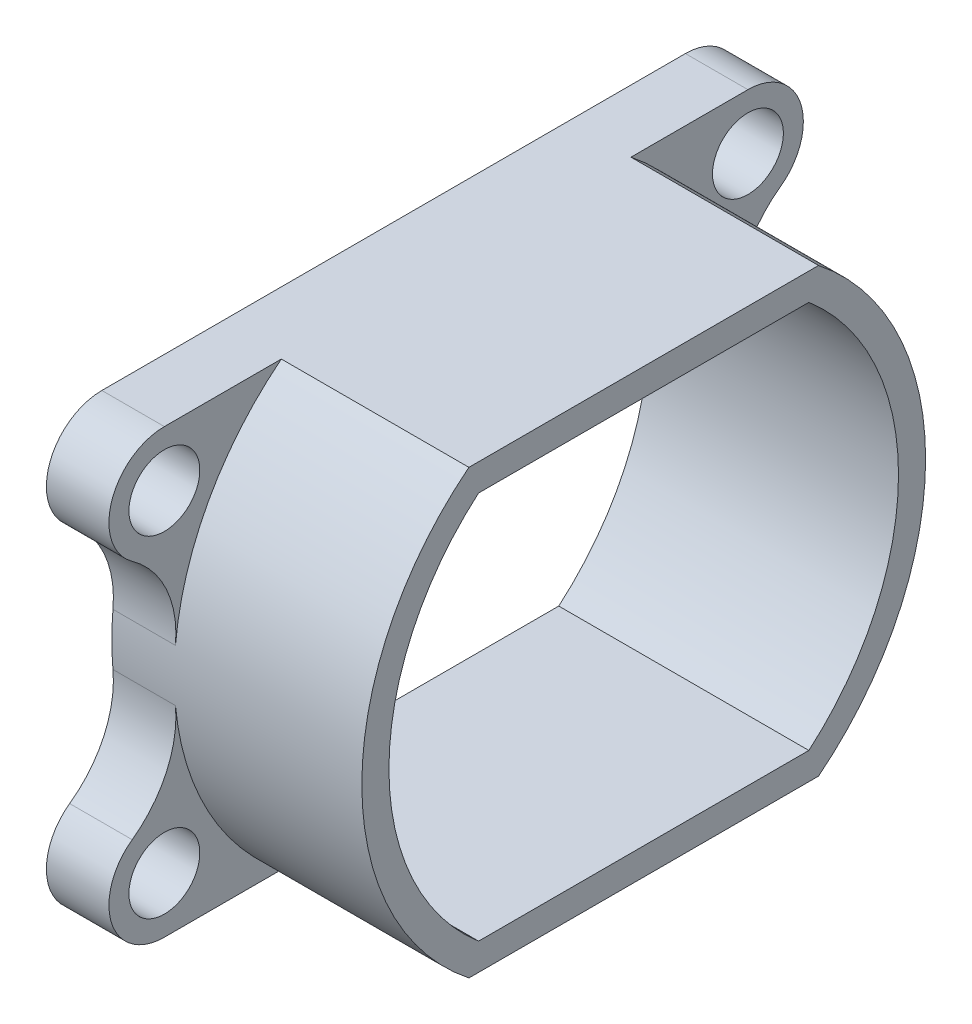
ISO-10303-21;
HEADER;
FILE_DESCRIPTION(('STEP AP214'),'2;1');
FILE_NAME('part.step','',(''),(''),'','','');
FILE_SCHEMA(('AUTOMOTIVE_DESIGN { 1 0 10303 214 1 1 1 1 }'));
ENDSEC;
DATA;
#1=APPLICATION_CONTEXT('core data for automotive mechanical design processes');
#2=APPLICATION_PROTOCOL_DEFINITION('international standard','automotive_design',2000,#1);
#3=PRODUCT_CONTEXT('',#1,'mechanical');
#4=PRODUCT('Part','Part','',(#3));
#5=PRODUCT_RELATED_PRODUCT_CATEGORY('part','',(#4));
#6=PRODUCT_DEFINITION_FORMATION('','',#4);
#7=PRODUCT_DEFINITION_CONTEXT('part definition',#1,'design');
#8=PRODUCT_DEFINITION('design','',#6,#7);
#9=PRODUCT_DEFINITION_SHAPE('','',#8);
#10=(LENGTH_UNIT() NAMED_UNIT(*) SI_UNIT(.MILLI.,.METRE.));
#11=(NAMED_UNIT(*) PLANE_ANGLE_UNIT() SI_UNIT($,.RADIAN.));
#12=(NAMED_UNIT(*) SI_UNIT($,.STERADIAN.) SOLID_ANGLE_UNIT());
#13=UNCERTAINTY_MEASURE_WITH_UNIT(LENGTH_MEASURE(1.E-05),#10,'distance_accuracy_value','');
#14=(GEOMETRIC_REPRESENTATION_CONTEXT(3) GLOBAL_UNCERTAINTY_ASSIGNED_CONTEXT((#13)) GLOBAL_UNIT_ASSIGNED_CONTEXT((#10,
#11,#12)) REPRESENTATION_CONTEXT('',''));
#15=CARTESIAN_POINT('',(0.,0.,0.));
#16=DIRECTION('',(0.,0.,1.));
#17=DIRECTION('',(1.,0.,0.));
#18=AXIS2_PLACEMENT_3D('',#15,#16,#17);
#19=CARTESIAN_POINT('',(12.,0.,0.));
#20=DIRECTION('',(-1.,0.,0.));
#21=DIRECTION('',(0.,0.,1.));
#22=AXIS2_PLACEMENT_3D('',#19,#20,#21);
#23=CYLINDRICAL_SURFACE('',#22,13.525);
#24=CARTESIAN_POINT('',(0.,0.,0.));
#25=DIRECTION('',(1.,0.,0.));
#26=DIRECTION('',(0.,0.,-1.));
#27=AXIS2_PLACEMENT_3D('',#24,#25,#26);
#28=CIRCLE('',#27,13.525);
#29=CARTESIAN_POINT('',(0.,1.25000368509018,13.4671123774646));
#30=VERTEX_POINT('',#29);
#31=CARTESIAN_POINT('',(0.,-1.25000368509018,13.4671123774646));
#32=VERTEX_POINT('',#31);
#33=EDGE_CURVE('E299',#30,#32,#28,.T.);
#34=ORIENTED_EDGE('',*,*,#33,.T.);
#35=DIRECTION('',(-1.,0.,0.));
#36=VECTOR('',#35,1.);
#37=CARTESIAN_POINT('',(12.,-1.25000368509018,13.4671123774646));
#38=LINE('',#37,#36);
#39=CARTESIAN_POINT('',(3.,-1.25000368509018,13.4671123774646));
#40=VERTEX_POINT('',#39);
#41=EDGE_CURVE('E344',#32,#40,#38,.F.);
#42=ORIENTED_EDGE('',*,*,#41,.T.);
#43=CARTESIAN_POINT('',(3.,0.,0.));
#44=DIRECTION('',(-1.,0.,0.));
#45=DIRECTION('',(0.,0.,1.));
#46=AXIS2_PLACEMENT_3D('',#43,#44,#45);
#47=CIRCLE('',#46,13.525);
#48=CARTESIAN_POINT('',(3.,-10.61,8.38770081726812));
#49=VERTEX_POINT('',#48);
#50=EDGE_CURVE('E220',#49,#40,#47,.T.);
#51=ORIENTED_EDGE('',*,*,#50,.F.);
#52=DIRECTION('',(-1.,0.,0.));
#53=VECTOR('',#52,1.);
#54=CARTESIAN_POINT('',(12.,-10.61,8.38770081726812));
#55=LINE('',#54,#53);
#56=CARTESIAN_POINT('',(12.,-10.61,8.38770081726812));
#57=VERTEX_POINT('',#56);
#58=EDGE_CURVE('E324',#57,#49,#55,.T.);
#59=ORIENTED_EDGE('',*,*,#58,.F.);
#60=CARTESIAN_POINT('',(12.,0.,0.));
#61=DIRECTION('',(1.,0.,0.));
#62=DIRECTION('',(0.,0.,-1.));
#63=AXIS2_PLACEMENT_3D('',#60,#61,#62);
#64=CIRCLE('',#63,13.525);
#65=CARTESIAN_POINT('',(12.,10.61,8.38770081726812));
#66=VERTEX_POINT('',#65);
#67=EDGE_CURVE('E300',#66,#57,#64,.T.);
#68=ORIENTED_EDGE('',*,*,#67,.F.);
#69=DIRECTION('',(-1.,0.,0.));
#70=VECTOR('',#69,1.);
#71=CARTESIAN_POINT('',(12.,10.61,8.38770081726812));
#72=LINE('',#71,#70);
#73=CARTESIAN_POINT('',(3.,10.61,8.38770081726812));
#74=VERTEX_POINT('',#73);
#75=EDGE_CURVE('E309',#66,#74,#72,.T.);
#76=ORIENTED_EDGE('',*,*,#75,.T.);
#77=CARTESIAN_POINT('',(3.,0.,0.));
#78=DIRECTION('',(-1.,0.,0.));
#79=DIRECTION('',(0.,0.,1.));
#80=AXIS2_PLACEMENT_3D('',#77,#78,#79);
#81=CIRCLE('',#80,13.525);
#82=CARTESIAN_POINT('',(3.,1.25000368509018,13.4671123774646));
#83=VERTEX_POINT('',#82);
#84=EDGE_CURVE('E187',#83,#74,#81,.T.);
#85=ORIENTED_EDGE('',*,*,#84,.F.);
#86=DIRECTION('',(-1.,0.,0.));
#87=VECTOR('',#86,1.);
#88=CARTESIAN_POINT('',(12.,1.25000368509018,13.4671123774646));
#89=LINE('',#88,#87);
#90=EDGE_CURVE('E341',#83,#30,#89,.T.);
#91=ORIENTED_EDGE('',*,*,#90,.T.);
#92=EDGE_LOOP('',(#34,#42,#51,#59,#68,#76,#85,#91));
#93=FACE_BOUND('',#92,.T.);
#94=ADVANCED_FACE('F43',(#93),#23,.T.);
#95=CARTESIAN_POINT('',(12.,0.,0.));
#96=DIRECTION('',(-1.,0.,0.));
#97=DIRECTION('',(0.,0.,1.));
#98=AXIS2_PLACEMENT_3D('',#95,#96,#97);
#99=CYLINDRICAL_SURFACE('',#98,13.525);
#100=CARTESIAN_POINT('',(3.,0.,0.));
#101=DIRECTION('',(-1.,0.,0.));
#102=DIRECTION('',(0.,0.,1.));
#103=AXIS2_PLACEMENT_3D('',#100,#101,#102);
#104=CIRCLE('',#103,13.525);
#105=CARTESIAN_POINT('',(3.,-1.25000368509018,-13.4671123774646));
#106=VERTEX_POINT('',#105);
#107=CARTESIAN_POINT('',(3.,-10.61,-8.38770081726812));
#108=VERTEX_POINT('',#107);
#109=EDGE_CURVE('E236',#106,#108,#104,.T.);
#110=ORIENTED_EDGE('',*,*,#109,.F.);
#111=DIRECTION('',(-1.,0.,0.));
#112=VECTOR('',#111,1.);
#113=CARTESIAN_POINT('',(12.,-1.25000368509018,-13.4671123774646));
#114=LINE('',#113,#112);
#115=CARTESIAN_POINT('',(0.,-1.25000368509018,-13.4671123774646));
#116=VERTEX_POINT('',#115);
#117=EDGE_CURVE('E330',#106,#116,#114,.T.);
#118=ORIENTED_EDGE('',*,*,#117,.T.);
#119=CARTESIAN_POINT('',(0.,0.,0.));
#120=DIRECTION('',(1.,0.,0.));
#121=DIRECTION('',(0.,0.,-1.));
#122=AXIS2_PLACEMENT_3D('',#119,#120,#121);
#123=CIRCLE('',#122,13.525);
#124=CARTESIAN_POINT('',(0.,1.25000368509017,-13.4671123774646));
#125=VERTEX_POINT('',#124);
#126=EDGE_CURVE('E314',#116,#125,#123,.T.);
#127=ORIENTED_EDGE('',*,*,#126,.T.);
#128=DIRECTION('',(-1.,0.,0.));
#129=VECTOR('',#128,1.);
#130=CARTESIAN_POINT('',(12.,1.25000368509017,-13.4671123774646));
#131=LINE('',#130,#129);
#132=CARTESIAN_POINT('',(3.,1.25000368509017,-13.4671123774646));
#133=VERTEX_POINT('',#132);
#134=EDGE_CURVE('E327',#125,#133,#131,.F.);
#135=ORIENTED_EDGE('',*,*,#134,.T.);
#136=CARTESIAN_POINT('',(3.,0.,0.));
#137=DIRECTION('',(-1.,0.,0.));
#138=DIRECTION('',(0.,0.,1.));
#139=AXIS2_PLACEMENT_3D('',#136,#137,#138);
#140=CIRCLE('',#139,13.525);
#141=CARTESIAN_POINT('',(3.,10.61,-8.38770081726812));
#142=VERTEX_POINT('',#141);
#143=EDGE_CURVE('E260',#142,#133,#140,.T.);
#144=ORIENTED_EDGE('',*,*,#143,.F.);
#145=DIRECTION('',(-1.,0.,0.));
#146=VECTOR('',#145,1.);
#147=CARTESIAN_POINT('',(12.,10.61,-8.38770081726812));
#148=LINE('',#147,#146);
#149=CARTESIAN_POINT('',(12.,10.61,-8.38770081726812));
#150=VERTEX_POINT('',#149);
#151=EDGE_CURVE('E319',#150,#142,#148,.T.);
#152=ORIENTED_EDGE('',*,*,#151,.F.);
#153=CARTESIAN_POINT('',(12.,0.,0.));
#154=DIRECTION('',(1.,0.,0.));
#155=DIRECTION('',(0.,0.,-1.));
#156=AXIS2_PLACEMENT_3D('',#153,#154,#155);
#157=CIRCLE('',#156,13.525);
#158=CARTESIAN_POINT('',(12.,-10.61,-8.38770081726812));
#159=VERTEX_POINT('',#158);
#160=EDGE_CURVE('E305',#159,#150,#157,.T.);
#161=ORIENTED_EDGE('',*,*,#160,.F.);
#162=DIRECTION('',(-1.,0.,0.));
#163=VECTOR('',#162,1.);
#164=CARTESIAN_POINT('',(12.,-10.61,-8.38770081726812));
#165=LINE('',#164,#163);
#166=EDGE_CURVE('E322',#159,#108,#165,.T.);
#167=ORIENTED_EDGE('',*,*,#166,.T.);
#168=EDGE_LOOP('',(#110,#118,#127,#135,#144,#152,#161,#167));
#169=FACE_BOUND('',#168,.T.);
#170=ADVANCED_FACE('F383',(#169),#99,.T.);
#171=CARTESIAN_POINT('',(12.,0.,0.));
#172=DIRECTION('',(1.,0.,0.));
#173=DIRECTION('',(0.,0.,-1.));
#174=AXIS2_PLACEMENT_3D('',#171,#172,#173);
#175=PLANE('',#174);
#176=ORIENTED_EDGE('',*,*,#67,.T.);
#177=DIRECTION('',(0.,0.,-1.));
#178=VECTOR('',#177,1.);
#179=CARTESIAN_POINT('',(12.,-10.61,8.38770081726812));
#180=LINE('',#179,#178);
#181=EDGE_CURVE('E303',#57,#159,#180,.T.);
#182=ORIENTED_EDGE('',*,*,#181,.T.);
#183=ORIENTED_EDGE('',*,*,#160,.T.);
#184=DIRECTION('',(0.,0.,1.));
#185=VECTOR('',#184,1.);
#186=CARTESIAN_POINT('',(12.,10.61,8.38770081726812));
#187=LINE('',#186,#185);
#188=EDGE_CURVE('E307',#150,#66,#187,.T.);
#189=ORIENTED_EDGE('',*,*,#188,.T.);
#190=EDGE_LOOP('',(#176,#182,#183,#189));
#191=FACE_BOUND('',#190,.T.);
#192=DIRECTION('',(0.,0.,-1.));
#193=VECTOR('',#192,1.);
#194=CARTESIAN_POINT('',(12.,-9.31,7.9230376119264));
#195=LINE('',#194,#193);
#196=CARTESIAN_POINT('',(12.,-9.31,7.9230376119264));
#197=VERTEX_POINT('',#196);
#198=CARTESIAN_POINT('',(12.,-9.31,-7.9230376119264));
#199=VERTEX_POINT('',#198);
#200=EDGE_CURVE('E271',#197,#199,#195,.T.);
#201=ORIENTED_EDGE('',*,*,#200,.F.);
#202=CARTESIAN_POINT('',(12.,0.,0.));
#203=DIRECTION('',(1.,0.,0.));
#204=DIRECTION('',(0.,0.,-1.));
#205=AXIS2_PLACEMENT_3D('',#202,#203,#204);
#206=CIRCLE('',#205,12.225);
#207=CARTESIAN_POINT('',(12.,9.31,7.9230376119264));
#208=VERTEX_POINT('',#207);
#209=EDGE_CURVE('E269',#208,#197,#206,.T.);
#210=ORIENTED_EDGE('',*,*,#209,.F.);
#211=DIRECTION('',(0.,0.,1.));
#212=VECTOR('',#211,1.);
#213=CARTESIAN_POINT('',(12.,9.31,7.9230376119264));
#214=LINE('',#213,#212);
#215=CARTESIAN_POINT('',(12.,9.31,-7.9230376119264));
#216=VERTEX_POINT('',#215);
#217=EDGE_CURVE('E277',#216,#208,#214,.T.);
#218=ORIENTED_EDGE('',*,*,#217,.F.);
#219=CARTESIAN_POINT('',(12.,0.,0.));
#220=DIRECTION('',(1.,0.,0.));
#221=DIRECTION('',(0.,0.,-1.));
#222=AXIS2_PLACEMENT_3D('',#219,#220,#221);
#223=CIRCLE('',#222,12.225);
#224=EDGE_CURVE('E274',#199,#216,#223,.T.);
#225=ORIENTED_EDGE('',*,*,#224,.F.);
#226=EDGE_LOOP('',(#201,#210,#218,#225));
#227=FACE_BOUND('',#226,.T.);
#228=ADVANCED_FACE('F389',(#191,#227),#175,.T.);
#229=CARTESIAN_POINT('',(0.,0.,0.));
#230=DIRECTION('',(1.,0.,0.));
#231=DIRECTION('',(0.,0.,-1.));
#232=AXIS2_PLACEMENT_3D('',#229,#230,#231);
#233=PLANE('',#232);
#234=ORIENTED_EDGE('',*,*,#33,.F.);
#235=CARTESIAN_POINT('',(0.,1.71211225628803,18.4457121473222));
#236=DIRECTION('',(1.,0.,0.));
#237=DIRECTION('',(0.,0.,-1.));
#238=AXIS2_PLACEMENT_3D('',#235,#236,#237);
#239=CIRCLE('',#238,5.);
#240=CARTESIAN_POINT('',(0.,5.78384054852822,15.5438112678691));
#241=VERTEX_POINT('',#240);
#242=EDGE_CURVE('E51',#30,#241,#239,.T.);
#243=ORIENTED_EDGE('',*,*,#242,.T.);
#244=CARTESIAN_POINT('',(0.,7.95,14.));
#245=DIRECTION('',(-1.,0.,0.));
#246=DIRECTION('',(0.,0.,1.));
#247=AXIS2_PLACEMENT_3D('',#244,#245,#246);
#248=CIRCLE('',#247,2.66);
#249=CARTESIAN_POINT('',(0.,10.61,14.));
#250=VERTEX_POINT('',#249);
#251=EDGE_CURVE('E203',#250,#241,#248,.F.);
#252=ORIENTED_EDGE('',*,*,#251,.F.);
#253=DIRECTION('',(0.,0.,1.));
#254=VECTOR('',#253,1.);
#255=CARTESIAN_POINT('',(0.,10.61,8.38770081726812));
#256=LINE('',#255,#254);
#257=CARTESIAN_POINT('',(0.,10.61,-14.));
#258=VERTEX_POINT('',#257);
#259=EDGE_CURVE('E195',#258,#250,#256,.T.);
#260=ORIENTED_EDGE('',*,*,#259,.F.);
#261=CARTESIAN_POINT('',(0.,7.94999999999999,-14.));
#262=DIRECTION('',(-1.,0.,0.));
#263=DIRECTION('',(0.,0.,1.));
#264=AXIS2_PLACEMENT_3D('',#261,#262,#263);
#265=CIRCLE('',#264,2.66);
#266=CARTESIAN_POINT('',(0.,5.78384054852821,-15.5438112678691));
#267=VERTEX_POINT('',#266);
#268=EDGE_CURVE('E254',#258,#267,#265,.T.);
#269=ORIENTED_EDGE('',*,*,#268,.T.);
#270=CARTESIAN_POINT('',(0.,1.71211225628802,-18.4457121473222));
#271=DIRECTION('',(1.,0.,0.));
#272=DIRECTION('',(0.,0.,-1.));
#273=AXIS2_PLACEMENT_3D('',#270,#271,#272);
#274=CIRCLE('',#273,5.);
#275=EDGE_CURVE('E353',#267,#125,#274,.T.);
#276=ORIENTED_EDGE('',*,*,#275,.T.);
#277=ORIENTED_EDGE('',*,*,#126,.F.);
#278=CARTESIAN_POINT('',(0.,-1.71211225628803,-18.4457121473222));
#279=DIRECTION('',(1.,0.,0.));
#280=DIRECTION('',(0.,0.,-1.));
#281=AXIS2_PLACEMENT_3D('',#278,#279,#280);
#282=CIRCLE('',#281,5.);
#283=CARTESIAN_POINT('',(0.,-5.78384054852822,-15.5438112678691));
#284=VERTEX_POINT('',#283);
#285=EDGE_CURVE('E348',#116,#284,#282,.T.);
#286=ORIENTED_EDGE('',*,*,#285,.T.);
#287=CARTESIAN_POINT('',(0.,-7.95,-14.));
#288=DIRECTION('',(-1.,0.,0.));
#289=DIRECTION('',(0.,0.,1.));
#290=AXIS2_PLACEMENT_3D('',#287,#288,#289);
#291=CIRCLE('',#290,2.66);
#292=CARTESIAN_POINT('',(0.,-10.61,-14.));
#293=VERTEX_POINT('',#292);
#294=EDGE_CURVE('E229',#293,#284,#291,.F.);
#295=ORIENTED_EDGE('',*,*,#294,.F.);
#296=DIRECTION('',(0.,0.,-1.));
#297=VECTOR('',#296,1.);
#298=CARTESIAN_POINT('',(0.,-10.61,8.38770081726812));
#299=LINE('',#298,#297);
#300=CARTESIAN_POINT('',(0.,-10.61,14.));
#301=VERTEX_POINT('',#300);
#302=EDGE_CURVE('E312',#301,#293,#299,.T.);
#303=ORIENTED_EDGE('',*,*,#302,.F.);
#304=CARTESIAN_POINT('',(0.,-7.95,14.));
#305=DIRECTION('',(-1.,0.,0.));
#306=DIRECTION('',(0.,0.,1.));
#307=AXIS2_PLACEMENT_3D('',#304,#305,#306);
#308=CIRCLE('',#307,2.66);
#309=CARTESIAN_POINT('',(0.,-5.78384054852822,15.5438112678691));
#310=VERTEX_POINT('',#309);
#311=EDGE_CURVE('E214',#301,#310,#308,.T.);
#312=ORIENTED_EDGE('',*,*,#311,.T.);
#313=CARTESIAN_POINT('',(0.,-1.71211225628803,18.4457121473222));
#314=DIRECTION('',(1.,0.,0.));
#315=DIRECTION('',(0.,0.,-1.));
#316=AXIS2_PLACEMENT_3D('',#313,#314,#315);
#317=CIRCLE('',#316,5.);
#318=EDGE_CURVE('E357',#310,#32,#317,.T.);
#319=ORIENTED_EDGE('',*,*,#318,.T.);
#320=EDGE_LOOP('',(#234,#243,#252,#260,#269,#276,#277,#286,#295,#303,#312,#319));
#321=FACE_BOUND('',#320,.T.);
#322=CARTESIAN_POINT('',(0.,0.,0.));
#323=DIRECTION('',(1.,0.,0.));
#324=DIRECTION('',(0.,0.,-1.));
#325=AXIS2_PLACEMENT_3D('',#322,#323,#324);
#326=CIRCLE('',#325,12.225);
#327=CARTESIAN_POINT('',(0.,9.31,7.9230376119264));
#328=VERTEX_POINT('',#327);
#329=CARTESIAN_POINT('',(0.,-9.31,7.9230376119264));
#330=VERTEX_POINT('',#329);
#331=EDGE_CURVE('E268',#328,#330,#326,.T.);
#332=ORIENTED_EDGE('',*,*,#331,.T.);
#333=DIRECTION('',(0.,0.,-1.));
#334=VECTOR('',#333,1.);
#335=CARTESIAN_POINT('',(0.,-9.31,7.9230376119264));
#336=LINE('',#335,#334);
#337=CARTESIAN_POINT('',(0.,-9.31,-7.9230376119264));
#338=VERTEX_POINT('',#337);
#339=EDGE_CURVE('E282',#330,#338,#336,.T.);
#340=ORIENTED_EDGE('',*,*,#339,.T.);
#341=CARTESIAN_POINT('',(0.,0.,0.));
#342=DIRECTION('',(1.,0.,0.));
#343=DIRECTION('',(0.,0.,-1.));
#344=AXIS2_PLACEMENT_3D('',#341,#342,#343);
#345=CIRCLE('',#344,12.225);
#346=CARTESIAN_POINT('',(0.,9.31,-7.9230376119264));
#347=VERTEX_POINT('',#346);
#348=EDGE_CURVE('E285',#338,#347,#345,.T.);
#349=ORIENTED_EDGE('',*,*,#348,.T.);
#350=DIRECTION('',(0.,0.,1.));
#351=VECTOR('',#350,1.);
#352=CARTESIAN_POINT('',(0.,9.31,7.9230376119264));
#353=LINE('',#352,#351);
#354=EDGE_CURVE('E272',#347,#328,#353,.T.);
#355=ORIENTED_EDGE('',*,*,#354,.T.);
#356=EDGE_LOOP('',(#332,#340,#349,#355));
#357=FACE_BOUND('',#356,.T.);
#358=CARTESIAN_POINT('',(0.,7.94999999999999,-14.));
#359=DIRECTION('',(-1.,0.,0.));
#360=DIRECTION('',(0.,0.,1.));
#361=AXIS2_PLACEMENT_3D('',#358,#359,#360);
#362=CIRCLE('',#361,1.7);
#363=CARTESIAN_POINT('',(0.,7.94999999999999,-12.3));
#364=VERTEX_POINT('',#363);
#365=EDGE_CURVE('E249',#364,#364,#362,.F.);
#366=ORIENTED_EDGE('',*,*,#365,.T.);
#367=EDGE_LOOP('',(#366));
#368=FACE_BOUND('',#367,.T.);
#369=CARTESIAN_POINT('',(0.,-7.95,-14.));
#370=DIRECTION('',(-1.,0.,0.));
#371=DIRECTION('',(0.,0.,1.));
#372=AXIS2_PLACEMENT_3D('',#369,#370,#371);
#373=CIRCLE('',#372,1.7);
#374=CARTESIAN_POINT('',(0.,-7.95,-12.3));
#375=VERTEX_POINT('',#374);
#376=EDGE_CURVE('E234',#375,#375,#373,.T.);
#377=ORIENTED_EDGE('',*,*,#376,.F.);
#378=EDGE_LOOP('',(#377));
#379=FACE_BOUND('',#378,.T.);
#380=CARTESIAN_POINT('',(0.,-7.95,14.));
#381=DIRECTION('',(-1.,0.,0.));
#382=DIRECTION('',(0.,0.,1.));
#383=AXIS2_PLACEMENT_3D('',#380,#381,#382);
#384=CIRCLE('',#383,1.7);
#385=CARTESIAN_POINT('',(0.,-7.95,15.7));
#386=VERTEX_POINT('',#385);
#387=EDGE_CURVE('E196',#386,#386,#384,.F.);
#388=ORIENTED_EDGE('',*,*,#387,.T.);
#389=EDGE_LOOP('',(#388));
#390=FACE_BOUND('',#389,.T.);
#391=CARTESIAN_POINT('',(0.,7.95,14.));
#392=DIRECTION('',(-1.,0.,0.));
#393=DIRECTION('',(0.,0.,1.));
#394=AXIS2_PLACEMENT_3D('',#391,#392,#393);
#395=CIRCLE('',#394,1.7);
#396=CARTESIAN_POINT('',(0.,7.95,15.7));
#397=VERTEX_POINT('',#396);
#398=EDGE_CURVE('E200',#397,#397,#395,.T.);
#399=ORIENTED_EDGE('',*,*,#398,.F.);
#400=EDGE_LOOP('',(#399));
#401=FACE_BOUND('',#400,.T.);
#402=ADVANCED_FACE('F372',(#321,#357,#368,#379,#390,#401),#233,.F.);
#403=CARTESIAN_POINT('',(12.,-10.61,8.38770081726812));
#404=DIRECTION('',(0.,1.,0.));
#405=DIRECTION('',(0.,0.,1.));
#406=AXIS2_PLACEMENT_3D('',#403,#404,#405);
#407=PLANE('',#406);
#408=ORIENTED_EDGE('',*,*,#302,.T.);
#409=DIRECTION('',(-1.,0.,0.));
#410=VECTOR('',#409,1.);
#411=CARTESIAN_POINT('',(3.,-10.61,-14.));
#412=LINE('',#411,#410);
#413=CARTESIAN_POINT('',(3.,-10.61,-14.));
#414=VERTEX_POINT('',#413);
#415=EDGE_CURVE('E242',#414,#293,#412,.T.);
#416=ORIENTED_EDGE('',*,*,#415,.F.);
#417=DIRECTION('',(0.,0.,-1.));
#418=VECTOR('',#417,1.);
#419=CARTESIAN_POINT('',(3.,-10.61,0.));
#420=LINE('',#419,#418);
#421=EDGE_CURVE('E233',#108,#414,#420,.T.);
#422=ORIENTED_EDGE('',*,*,#421,.F.);
#423=ORIENTED_EDGE('',*,*,#166,.F.);
#424=ORIENTED_EDGE('',*,*,#181,.F.);
#425=ORIENTED_EDGE('',*,*,#58,.T.);
#426=DIRECTION('',(0.,0.,1.));
#427=VECTOR('',#426,1.);
#428=CARTESIAN_POINT('',(3.,-10.61,0.));
#429=LINE('',#428,#427);
#430=CARTESIAN_POINT('',(3.,-10.61,14.));
#431=VERTEX_POINT('',#430);
#432=EDGE_CURVE('E213',#49,#431,#429,.T.);
#433=ORIENTED_EDGE('',*,*,#432,.T.);
#434=DIRECTION('',(-1.,0.,0.));
#435=VECTOR('',#434,1.);
#436=CARTESIAN_POINT('',(3.,-10.61,14.));
#437=LINE('',#436,#435);
#438=EDGE_CURVE('E222',#431,#301,#437,.T.);
#439=ORIENTED_EDGE('',*,*,#438,.T.);
#440=EDGE_LOOP('',(#408,#416,#422,#423,#424,#425,#433,#439));
#441=FACE_BOUND('',#440,.T.);
#442=ADVANCED_FACE('F394',(#441),#407,.F.);
#443=CARTESIAN_POINT('',(12.,10.61,8.38770081726812));
#444=DIRECTION('',(0.,-1.,0.));
#445=DIRECTION('',(0.,0.,-1.));
#446=AXIS2_PLACEMENT_3D('',#443,#444,#445);
#447=PLANE('',#446);
#448=ORIENTED_EDGE('',*,*,#259,.T.);
#449=DIRECTION('',(-1.,0.,0.));
#450=VECTOR('',#449,1.);
#451=CARTESIAN_POINT('',(3.,10.61,14.));
#452=LINE('',#451,#450);
#453=CARTESIAN_POINT('',(3.,10.61,14.));
#454=VERTEX_POINT('',#453);
#455=EDGE_CURVE('E192',#454,#250,#452,.T.);
#456=ORIENTED_EDGE('',*,*,#455,.F.);
#457=DIRECTION('',(0.,0.,1.));
#458=VECTOR('',#457,1.);
#459=CARTESIAN_POINT('',(3.,10.61,0.));
#460=LINE('',#459,#458);
#461=EDGE_CURVE('E181',#74,#454,#460,.T.);
#462=ORIENTED_EDGE('',*,*,#461,.F.);
#463=ORIENTED_EDGE('',*,*,#75,.F.);
#464=ORIENTED_EDGE('',*,*,#188,.F.);
#465=ORIENTED_EDGE('',*,*,#151,.T.);
#466=DIRECTION('',(0.,0.,-1.));
#467=VECTOR('',#466,1.);
#468=CARTESIAN_POINT('',(3.,10.61,0.));
#469=LINE('',#468,#467);
#470=CARTESIAN_POINT('',(3.,10.61,-14.));
#471=VERTEX_POINT('',#470);
#472=EDGE_CURVE('E253',#142,#471,#469,.T.);
#473=ORIENTED_EDGE('',*,*,#472,.T.);
#474=DIRECTION('',(-1.,0.,0.));
#475=VECTOR('',#474,1.);
#476=CARTESIAN_POINT('',(3.,10.61,-14.));
#477=LINE('',#476,#475);
#478=EDGE_CURVE('E262',#471,#258,#477,.T.);
#479=ORIENTED_EDGE('',*,*,#478,.T.);
#480=EDGE_LOOP('',(#448,#456,#462,#463,#464,#465,#473,#479));
#481=FACE_BOUND('',#480,.T.);
#482=ADVANCED_FACE('F193',(#481),#447,.F.);
#483=CARTESIAN_POINT('',(12.,0.,0.));
#484=DIRECTION('',(-1.,0.,0.));
#485=DIRECTION('',(0.,0.,1.));
#486=AXIS2_PLACEMENT_3D('',#483,#484,#485);
#487=CYLINDRICAL_SURFACE('',#486,12.225);
#488=ORIENTED_EDGE('',*,*,#331,.F.);
#489=DIRECTION('',(-1.,0.,0.));
#490=VECTOR('',#489,1.);
#491=CARTESIAN_POINT('',(12.,9.31,7.9230376119264));
#492=LINE('',#491,#490);
#493=EDGE_CURVE('E279',#208,#328,#492,.T.);
#494=ORIENTED_EDGE('',*,*,#493,.F.);
#495=ORIENTED_EDGE('',*,*,#209,.T.);
#496=DIRECTION('',(-1.,0.,0.));
#497=VECTOR('',#496,1.);
#498=CARTESIAN_POINT('',(12.,-9.31,7.9230376119264));
#499=LINE('',#498,#497);
#500=EDGE_CURVE('E296',#197,#330,#499,.T.);
#501=ORIENTED_EDGE('',*,*,#500,.T.);
#502=EDGE_LOOP('',(#488,#494,#495,#501));
#503=FACE_BOUND('',#502,.T.);
#504=ADVANCED_FACE('F451',(#503),#487,.F.);
#505=CARTESIAN_POINT('',(12.,-9.31,7.9230376119264));
#506=DIRECTION('',(0.,1.,0.));
#507=DIRECTION('',(0.,0.,1.));
#508=AXIS2_PLACEMENT_3D('',#505,#506,#507);
#509=PLANE('',#508);
#510=ORIENTED_EDGE('',*,*,#339,.F.);
#511=ORIENTED_EDGE('',*,*,#500,.F.);
#512=ORIENTED_EDGE('',*,*,#200,.T.);
#513=DIRECTION('',(-1.,0.,0.));
#514=VECTOR('',#513,1.);
#515=CARTESIAN_POINT('',(12.,-9.31,-7.9230376119264));
#516=LINE('',#515,#514);
#517=EDGE_CURVE('E294',#199,#338,#516,.T.);
#518=ORIENTED_EDGE('',*,*,#517,.T.);
#519=EDGE_LOOP('',(#510,#511,#512,#518));
#520=FACE_BOUND('',#519,.T.);
#521=ADVANCED_FACE('F444',(#520),#509,.T.);
#522=CARTESIAN_POINT('',(12.,0.,0.));
#523=DIRECTION('',(-1.,0.,0.));
#524=DIRECTION('',(0.,0.,1.));
#525=AXIS2_PLACEMENT_3D('',#522,#523,#524);
#526=CYLINDRICAL_SURFACE('',#525,12.225);
#527=ORIENTED_EDGE('',*,*,#348,.F.);
#528=ORIENTED_EDGE('',*,*,#517,.F.);
#529=ORIENTED_EDGE('',*,*,#224,.T.);
#530=DIRECTION('',(-1.,0.,0.));
#531=VECTOR('',#530,1.);
#532=CARTESIAN_POINT('',(12.,9.31,-7.9230376119264));
#533=LINE('',#532,#531);
#534=EDGE_CURVE('E292',#216,#347,#533,.T.);
#535=ORIENTED_EDGE('',*,*,#534,.T.);
#536=EDGE_LOOP('',(#527,#528,#529,#535));
#537=FACE_BOUND('',#536,.T.);
#538=ADVANCED_FACE('F447',(#537),#526,.F.);
#539=CARTESIAN_POINT('',(12.,9.31,7.9230376119264));
#540=DIRECTION('',(0.,-1.,0.));
#541=DIRECTION('',(0.,0.,-1.));
#542=AXIS2_PLACEMENT_3D('',#539,#540,#541);
#543=PLANE('',#542);
#544=ORIENTED_EDGE('',*,*,#354,.F.);
#545=ORIENTED_EDGE('',*,*,#534,.F.);
#546=ORIENTED_EDGE('',*,*,#217,.T.);
#547=ORIENTED_EDGE('',*,*,#493,.T.);
#548=EDGE_LOOP('',(#544,#545,#546,#547));
#549=FACE_BOUND('',#548,.T.);
#550=ADVANCED_FACE('F454',(#549),#543,.T.);
#551=CARTESIAN_POINT('',(3.,7.94999999999999,-14.));
#552=DIRECTION('',(-1.,0.,0.));
#553=DIRECTION('',(0.,0.,1.));
#554=AXIS2_PLACEMENT_3D('',#551,#552,#553);
#555=CYLINDRICAL_SURFACE('',#554,1.7);
#556=CARTESIAN_POINT('',(3.,7.94999999999999,-14.));
#557=DIRECTION('',(-1.,0.,0.));
#558=DIRECTION('',(0.,0.,1.));
#559=AXIS2_PLACEMENT_3D('',#556,#557,#558);
#560=CIRCLE('',#559,1.7);
#561=CARTESIAN_POINT('',(3.,7.94999999999999,-12.3));
#562=VERTEX_POINT('',#561);
#563=EDGE_CURVE('E250',#562,#562,#560,.F.);
#564=ORIENTED_EDGE('',*,*,#563,.T.);
#565=EDGE_LOOP('',(#564));
#566=FACE_BOUND('',#565,.T.);
#567=ORIENTED_EDGE('',*,*,#365,.F.);
#568=EDGE_LOOP('',(#567));
#569=FACE_BOUND('',#568,.T.);
#570=ADVANCED_FACE('F456',(#566,#569),#555,.F.);
#571=CARTESIAN_POINT('',(3.,7.94999999999999,-14.));
#572=DIRECTION('',(-1.,0.,0.));
#573=DIRECTION('',(0.,0.,1.));
#574=AXIS2_PLACEMENT_3D('',#571,#572,#573);
#575=CYLINDRICAL_SURFACE('',#574,2.66);
#576=CARTESIAN_POINT('',(3.,7.94999999999999,-14.));
#577=DIRECTION('',(-1.,0.,0.));
#578=DIRECTION('',(0.,0.,1.));
#579=AXIS2_PLACEMENT_3D('',#576,#577,#578);
#580=CIRCLE('',#579,2.66);
#581=CARTESIAN_POINT('',(3.,5.78384054852821,-15.5438112678691));
#582=VERTEX_POINT('',#581);
#583=EDGE_CURVE('E257',#471,#582,#580,.T.);
#584=ORIENTED_EDGE('',*,*,#583,.T.);
#585=DIRECTION('',(-1.,0.,0.));
#586=VECTOR('',#585,1.);
#587=CARTESIAN_POINT('',(3.,5.78384054852821,-15.5438112678691));
#588=LINE('',#587,#586);
#589=EDGE_CURVE('E335',#582,#267,#588,.T.);
#590=ORIENTED_EDGE('',*,*,#589,.T.);
#591=ORIENTED_EDGE('',*,*,#268,.F.);
#592=ORIENTED_EDGE('',*,*,#478,.F.);
#593=EDGE_LOOP('',(#584,#590,#591,#592));
#594=FACE_BOUND('',#593,.T.);
#595=ADVANCED_FACE('F411',(#594),#575,.T.);
#596=CARTESIAN_POINT('',(3.,0.,0.));
#597=DIRECTION('',(-1.,0.,0.));
#598=DIRECTION('',(0.,0.,1.));
#599=AXIS2_PLACEMENT_3D('',#596,#597,#598);
#600=PLANE('',#599);
#601=ORIENTED_EDGE('',*,*,#563,.F.);
#602=EDGE_LOOP('',(#601));
#603=FACE_BOUND('',#602,.T.);
#604=ORIENTED_EDGE('',*,*,#472,.F.);
#605=ORIENTED_EDGE('',*,*,#143,.T.);
#606=CARTESIAN_POINT('',(3.,1.71211225628802,-18.4457121473222));
#607=DIRECTION('',(-1.,0.,0.));
#608=DIRECTION('',(0.,0.,1.));
#609=AXIS2_PLACEMENT_3D('',#606,#607,#608);
#610=CIRCLE('',#609,5.);
#611=EDGE_CURVE('E355',#133,#582,#610,.T.);
#612=ORIENTED_EDGE('',*,*,#611,.T.);
#613=ORIENTED_EDGE('',*,*,#583,.F.);
#614=EDGE_LOOP('',(#604,#605,#612,#613));
#615=FACE_BOUND('',#614,.T.);
#616=ADVANCED_FACE('F408',(#603,#615),#600,.F.);
#617=CARTESIAN_POINT('',(3.,-7.95,-14.));
#618=DIRECTION('',(-1.,0.,0.));
#619=DIRECTION('',(0.,0.,1.));
#620=AXIS2_PLACEMENT_3D('',#617,#618,#619);
#621=CYLINDRICAL_SURFACE('',#620,2.66);
#622=ORIENTED_EDGE('',*,*,#294,.T.);
#623=DIRECTION('',(-1.,0.,0.));
#624=VECTOR('',#623,1.);
#625=CARTESIAN_POINT('',(3.,-5.78384054852822,-15.5438112678691));
#626=LINE('',#625,#624);
#627=CARTESIAN_POINT('',(3.,-5.78384054852822,-15.5438112678691));
#628=VERTEX_POINT('',#627);
#629=EDGE_CURVE('E333',#284,#628,#626,.F.);
#630=ORIENTED_EDGE('',*,*,#629,.T.);
#631=CARTESIAN_POINT('',(3.,-7.95,-14.));
#632=DIRECTION('',(-1.,0.,0.));
#633=DIRECTION('',(0.,0.,1.));
#634=AXIS2_PLACEMENT_3D('',#631,#632,#633);
#635=CIRCLE('',#634,2.66);
#636=EDGE_CURVE('E230',#414,#628,#635,.F.);
#637=ORIENTED_EDGE('',*,*,#636,.F.);
#638=ORIENTED_EDGE('',*,*,#415,.T.);
#639=EDGE_LOOP('',(#622,#630,#637,#638));
#640=FACE_BOUND('',#639,.T.);
#641=ADVANCED_FACE('F421',(#640),#621,.T.);
#642=CARTESIAN_POINT('',(3.,-7.95,-14.));
#643=DIRECTION('',(-1.,0.,0.));
#644=DIRECTION('',(0.,0.,1.));
#645=AXIS2_PLACEMENT_3D('',#642,#643,#644);
#646=CYLINDRICAL_SURFACE('',#645,1.7);
#647=CARTESIAN_POINT('',(3.,-7.95,-14.));
#648=DIRECTION('',(-1.,0.,0.));
#649=DIRECTION('',(0.,0.,1.));
#650=AXIS2_PLACEMENT_3D('',#647,#648,#649);
#651=CIRCLE('',#650,1.7);
#652=CARTESIAN_POINT('',(3.,-7.95,-12.3));
#653=VERTEX_POINT('',#652);
#654=EDGE_CURVE('E239',#653,#653,#651,.T.);
#655=ORIENTED_EDGE('',*,*,#654,.F.);
#656=EDGE_LOOP('',(#655));
#657=FACE_BOUND('',#656,.T.);
#658=ORIENTED_EDGE('',*,*,#376,.T.);
#659=EDGE_LOOP('',(#658));
#660=FACE_BOUND('',#659,.T.);
#661=ADVANCED_FACE('F525',(#657,#660),#646,.F.);
#662=CARTESIAN_POINT('',(3.,0.,0.));
#663=DIRECTION('',(-1.,0.,0.));
#664=DIRECTION('',(0.,0.,1.));
#665=AXIS2_PLACEMENT_3D('',#662,#663,#664);
#666=PLANE('',#665);
#667=ORIENTED_EDGE('',*,*,#636,.T.);
#668=CARTESIAN_POINT('',(3.,-1.71211225628803,-18.4457121473222));
#669=DIRECTION('',(-1.,0.,0.));
#670=DIRECTION('',(0.,0.,1.));
#671=AXIS2_PLACEMENT_3D('',#668,#669,#670);
#672=CIRCLE('',#671,5.);
#673=EDGE_CURVE('E350',#628,#106,#672,.T.);
#674=ORIENTED_EDGE('',*,*,#673,.T.);
#675=ORIENTED_EDGE('',*,*,#109,.T.);
#676=ORIENTED_EDGE('',*,*,#421,.T.);
#677=EDGE_LOOP('',(#667,#674,#675,#676));
#678=FACE_BOUND('',#677,.T.);
#679=ORIENTED_EDGE('',*,*,#654,.T.);
#680=EDGE_LOOP('',(#679));
#681=FACE_BOUND('',#680,.T.);
#682=ADVANCED_FACE('F426',(#678,#681),#666,.F.);
#683=CARTESIAN_POINT('',(3.,-7.95,14.));
#684=DIRECTION('',(-1.,0.,0.));
#685=DIRECTION('',(0.,0.,1.));
#686=AXIS2_PLACEMENT_3D('',#683,#684,#685);
#687=CYLINDRICAL_SURFACE('',#686,1.7);
#688=CARTESIAN_POINT('',(3.,-7.95,14.));
#689=DIRECTION('',(-1.,0.,0.));
#690=DIRECTION('',(0.,0.,1.));
#691=AXIS2_PLACEMENT_3D('',#688,#689,#690);
#692=CIRCLE('',#691,1.7);
#693=CARTESIAN_POINT('',(3.,-7.95,15.7));
#694=VERTEX_POINT('',#693);
#695=EDGE_CURVE('E210',#694,#694,#692,.F.);
#696=ORIENTED_EDGE('',*,*,#695,.T.);
#697=EDGE_LOOP('',(#696));
#698=FACE_BOUND('',#697,.T.);
#699=ORIENTED_EDGE('',*,*,#387,.F.);
#700=EDGE_LOOP('',(#699));
#701=FACE_BOUND('',#700,.T.);
#702=ADVANCED_FACE('F543',(#698,#701),#687,.F.);
#703=CARTESIAN_POINT('',(3.,-7.95,14.));
#704=DIRECTION('',(-1.,0.,0.));
#705=DIRECTION('',(0.,0.,1.));
#706=AXIS2_PLACEMENT_3D('',#703,#704,#705);
#707=CYLINDRICAL_SURFACE('',#706,2.66);
#708=CARTESIAN_POINT('',(3.,-7.95,14.));
#709=DIRECTION('',(-1.,0.,0.));
#710=DIRECTION('',(0.,0.,1.));
#711=AXIS2_PLACEMENT_3D('',#708,#709,#710);
#712=CIRCLE('',#711,2.66);
#713=CARTESIAN_POINT('',(3.,-5.78384054852822,15.5438112678691));
#714=VERTEX_POINT('',#713);
#715=EDGE_CURVE('E217',#431,#714,#712,.T.);
#716=ORIENTED_EDGE('',*,*,#715,.T.);
#717=DIRECTION('',(-1.,0.,0.));
#718=VECTOR('',#717,1.);
#719=CARTESIAN_POINT('',(3.,-5.78384054852822,15.5438112678691));
#720=LINE('',#719,#718);
#721=EDGE_CURVE('E338',#714,#310,#720,.T.);
#722=ORIENTED_EDGE('',*,*,#721,.T.);
#723=ORIENTED_EDGE('',*,*,#311,.F.);
#724=ORIENTED_EDGE('',*,*,#438,.F.);
#725=EDGE_LOOP('',(#716,#722,#723,#724));
#726=FACE_BOUND('',#725,.T.);
#727=ADVANCED_FACE('F369',(#726),#707,.T.);
#728=CARTESIAN_POINT('',(3.,0.,0.));
#729=DIRECTION('',(-1.,0.,0.));
#730=DIRECTION('',(0.,0.,1.));
#731=AXIS2_PLACEMENT_3D('',#728,#729,#730);
#732=PLANE('',#731);
#733=ORIENTED_EDGE('',*,*,#695,.F.);
#734=EDGE_LOOP('',(#733));
#735=FACE_BOUND('',#734,.T.);
#736=ORIENTED_EDGE('',*,*,#432,.F.);
#737=ORIENTED_EDGE('',*,*,#50,.T.);
#738=CARTESIAN_POINT('',(3.,-1.71211225628803,18.4457121473222));
#739=DIRECTION('',(-1.,0.,0.));
#740=DIRECTION('',(0.,0.,1.));
#741=AXIS2_PLACEMENT_3D('',#738,#739,#740);
#742=CIRCLE('',#741,5.);
#743=EDGE_CURVE('E359',#40,#714,#742,.T.);
#744=ORIENTED_EDGE('',*,*,#743,.T.);
#745=ORIENTED_EDGE('',*,*,#715,.F.);
#746=EDGE_LOOP('',(#736,#737,#744,#745));
#747=FACE_BOUND('',#746,.T.);
#748=ADVANCED_FACE('F363',(#735,#747),#732,.F.);
#749=CARTESIAN_POINT('',(3.,7.95,14.));
#750=DIRECTION('',(-1.,0.,0.));
#751=DIRECTION('',(0.,0.,1.));
#752=AXIS2_PLACEMENT_3D('',#749,#750,#751);
#753=CYLINDRICAL_SURFACE('',#752,2.66);
#754=ORIENTED_EDGE('',*,*,#251,.T.);
#755=DIRECTION('',(-1.,0.,0.));
#756=VECTOR('',#755,1.);
#757=CARTESIAN_POINT('',(3.,5.78384054852822,15.5438112678691));
#758=LINE('',#757,#756);
#759=CARTESIAN_POINT('',(3.,5.78384054852822,15.5438112678691));
#760=VERTEX_POINT('',#759);
#761=EDGE_CURVE('E58',#241,#760,#758,.F.);
#762=ORIENTED_EDGE('',*,*,#761,.T.);
#763=CARTESIAN_POINT('',(3.,7.95,14.));
#764=DIRECTION('',(-1.,0.,0.));
#765=DIRECTION('',(0.,0.,1.));
#766=AXIS2_PLACEMENT_3D('',#763,#764,#765);
#767=CIRCLE('',#766,2.66);
#768=EDGE_CURVE('E185',#454,#760,#767,.F.);
#769=ORIENTED_EDGE('',*,*,#768,.F.);
#770=ORIENTED_EDGE('',*,*,#455,.T.);
#771=EDGE_LOOP('',(#754,#762,#769,#770));
#772=FACE_BOUND('',#771,.T.);
#773=ADVANCED_FACE('F199',(#772),#753,.T.);
#774=CARTESIAN_POINT('',(3.,7.95,14.));
#775=DIRECTION('',(-1.,0.,0.));
#776=DIRECTION('',(0.,0.,1.));
#777=AXIS2_PLACEMENT_3D('',#774,#775,#776);
#778=CYLINDRICAL_SURFACE('',#777,1.7);
#779=CARTESIAN_POINT('',(3.,7.95,14.));
#780=DIRECTION('',(-1.,0.,0.));
#781=DIRECTION('',(0.,0.,1.));
#782=AXIS2_PLACEMENT_3D('',#779,#780,#781);
#783=CIRCLE('',#782,1.7);
#784=CARTESIAN_POINT('',(3.,7.95,15.7));
#785=VERTEX_POINT('',#784);
#786=EDGE_CURVE('E197',#785,#785,#783,.T.);
#787=ORIENTED_EDGE('',*,*,#786,.F.);
#788=EDGE_LOOP('',(#787));
#789=FACE_BOUND('',#788,.T.);
#790=ORIENTED_EDGE('',*,*,#398,.T.);
#791=EDGE_LOOP('',(#790));
#792=FACE_BOUND('',#791,.T.);
#793=ADVANCED_FACE('F577',(#789,#792),#778,.F.);
#794=CARTESIAN_POINT('',(3.,0.,0.));
#795=DIRECTION('',(-1.,0.,0.));
#796=DIRECTION('',(0.,0.,1.));
#797=AXIS2_PLACEMENT_3D('',#794,#795,#796);
#798=PLANE('',#797);
#799=ORIENTED_EDGE('',*,*,#768,.T.);
#800=CARTESIAN_POINT('',(3.,1.71211225628803,18.4457121473222));
#801=DIRECTION('',(-1.,0.,0.));
#802=DIRECTION('',(0.,0.,1.));
#803=AXIS2_PLACEMENT_3D('',#800,#801,#802);
#804=CIRCLE('',#803,5.);
#805=EDGE_CURVE('E11',#760,#83,#804,.T.);
#806=ORIENTED_EDGE('',*,*,#805,.T.);
#807=ORIENTED_EDGE('',*,*,#84,.T.);
#808=ORIENTED_EDGE('',*,*,#461,.T.);
#809=EDGE_LOOP('',(#799,#806,#807,#808));
#810=FACE_BOUND('',#809,.T.);
#811=ORIENTED_EDGE('',*,*,#786,.T.);
#812=EDGE_LOOP('',(#811));
#813=FACE_BOUND('',#812,.T.);
#814=ADVANCED_FACE('F183',(#810,#813),#798,.F.);
#815=CARTESIAN_POINT('',(3.,-1.71211225628803,-18.4457121473222));
#816=DIRECTION('',(1.,0.,0.));
#817=DIRECTION('',(0.,0.,-1.));
#818=AXIS2_PLACEMENT_3D('',#815,#816,#817);
#819=CYLINDRICAL_SURFACE('',#818,5.);
#820=ORIENTED_EDGE('',*,*,#673,.F.);
#821=ORIENTED_EDGE('',*,*,#629,.F.);
#822=ORIENTED_EDGE('',*,*,#285,.F.);
#823=ORIENTED_EDGE('',*,*,#117,.F.);
#824=EDGE_LOOP('',(#820,#821,#822,#823));
#825=FACE_BOUND('',#824,.T.);
#826=ADVANCED_FACE('F395',(#825),#819,.F.);
#827=CARTESIAN_POINT('',(12.,1.71211225628802,-18.4457121473222));
#828=DIRECTION('',(1.,0.,0.));
#829=DIRECTION('',(0.,0.,-1.));
#830=AXIS2_PLACEMENT_3D('',#827,#828,#829);
#831=CYLINDRICAL_SURFACE('',#830,5.);
#832=ORIENTED_EDGE('',*,*,#611,.F.);
#833=ORIENTED_EDGE('',*,*,#134,.F.);
#834=ORIENTED_EDGE('',*,*,#275,.F.);
#835=ORIENTED_EDGE('',*,*,#589,.F.);
#836=EDGE_LOOP('',(#832,#833,#834,#835));
#837=FACE_BOUND('',#836,.T.);
#838=ADVANCED_FACE('F381',(#837),#831,.F.);
#839=CARTESIAN_POINT('',(12.,-1.71211225628803,18.4457121473222));
#840=DIRECTION('',(1.,0.,0.));
#841=DIRECTION('',(0.,0.,-1.));
#842=AXIS2_PLACEMENT_3D('',#839,#840,#841);
#843=CYLINDRICAL_SURFACE('',#842,5.);
#844=ORIENTED_EDGE('',*,*,#743,.F.);
#845=ORIENTED_EDGE('',*,*,#41,.F.);
#846=ORIENTED_EDGE('',*,*,#318,.F.);
#847=ORIENTED_EDGE('',*,*,#721,.F.);
#848=EDGE_LOOP('',(#844,#845,#846,#847));
#849=FACE_BOUND('',#848,.T.);
#850=ADVANCED_FACE('F371',(#849),#843,.F.);
#851=CARTESIAN_POINT('',(3.,1.71211225628803,18.4457121473222));
#852=DIRECTION('',(1.,0.,0.));
#853=DIRECTION('',(0.,0.,-1.));
#854=AXIS2_PLACEMENT_3D('',#851,#852,#853);
#855=CYLINDRICAL_SURFACE('',#854,5.);
#856=ORIENTED_EDGE('',*,*,#805,.F.);
#857=ORIENTED_EDGE('',*,*,#761,.F.);
#858=ORIENTED_EDGE('',*,*,#242,.F.);
#859=ORIENTED_EDGE('',*,*,#90,.F.);
#860=EDGE_LOOP('',(#856,#857,#858,#859));
#861=FACE_BOUND('',#860,.T.);
#862=ADVANCED_FACE('F45',(#861),#855,.F.);
#863=CLOSED_SHELL('',(#94,#170,#228,#402,#442,#482,#504,#521,#538,#550,#570,#595,#616,#641,#661,
#682,#702,#727,#748,#773,#793,#814,#826,#838,#850,#862));
#864=MANIFOLD_SOLID_BREP('B2',#863);
#865=ADVANCED_BREP_SHAPE_REPRESENTATION('',(#18,#864),#14);
#866=SHAPE_DEFINITION_REPRESENTATION(#9,#865);
ENDSEC;
END-ISO-10303-21;
